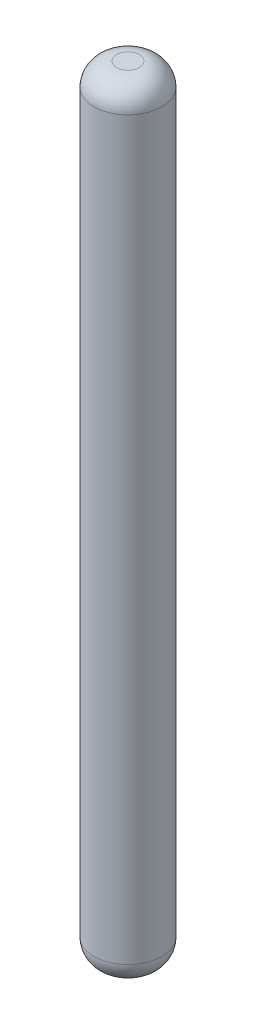
ISO-10303-21;
HEADER;
FILE_DESCRIPTION(('STEP AP214'),'2;1');
FILE_NAME('part.step','',(''),(''),'','','');
FILE_SCHEMA(('AUTOMOTIVE_DESIGN { 1 0 10303 214 1 1 1 1 }'));
ENDSEC;
DATA;
#1=APPLICATION_CONTEXT('core data for automotive mechanical design processes');
#2=APPLICATION_PROTOCOL_DEFINITION('international standard','automotive_design',2000,#1);
#3=PRODUCT_CONTEXT('',#1,'mechanical');
#4=PRODUCT('Part','Part','',(#3));
#5=PRODUCT_RELATED_PRODUCT_CATEGORY('part','',(#4));
#6=PRODUCT_DEFINITION_FORMATION('','',#4);
#7=PRODUCT_DEFINITION_CONTEXT('part definition',#1,'design');
#8=PRODUCT_DEFINITION('design','',#6,#7);
#9=PRODUCT_DEFINITION_SHAPE('','',#8);
#10=(LENGTH_UNIT() NAMED_UNIT(*) SI_UNIT(.MILLI.,.METRE.));
#11=(NAMED_UNIT(*) PLANE_ANGLE_UNIT() SI_UNIT($,.RADIAN.));
#12=(NAMED_UNIT(*) SI_UNIT($,.STERADIAN.) SOLID_ANGLE_UNIT());
#13=UNCERTAINTY_MEASURE_WITH_UNIT(LENGTH_MEASURE(1.E-05),#10,'distance_accuracy_value','');
#14=(GEOMETRIC_REPRESENTATION_CONTEXT(3) GLOBAL_UNCERTAINTY_ASSIGNED_CONTEXT((#13)) GLOBAL_UNIT_ASSIGNED_CONTEXT((#10,
#11,#12)) REPRESENTATION_CONTEXT('',''));
#15=CARTESIAN_POINT('',(0.,0.,0.));
#16=DIRECTION('',(0.,0.,1.));
#17=DIRECTION('',(1.,0.,0.));
#18=AXIS2_PLACEMENT_3D('',#15,#16,#17);
#19=CARTESIAN_POINT('',(0.,34.5,0.));
#20=DIRECTION('',(0.,-1.,0.));
#21=DIRECTION('',(0.,0.,-1.));
#22=AXIS2_PLACEMENT_3D('',#19,#20,#21);
#23=CYLINDRICAL_SURFACE('',#22,1.5);
#24=CARTESIAN_POINT('',(0.,33.5,0.));
#25=DIRECTION('',(0.,1.,0.));
#26=DIRECTION('',(0.,0.,1.));
#27=AXIS2_PLACEMENT_3D('',#24,#25,#26);
#28=CIRCLE('',#27,1.5);
#29=CARTESIAN_POINT('',(0.,33.5,1.5));
#30=VERTEX_POINT('',#29);
#31=EDGE_CURVE('E38',#30,#30,#28,.F.);
#32=ORIENTED_EDGE('',*,*,#31,.T.);
#33=EDGE_LOOP('',(#32));
#34=FACE_BOUND('',#33,.T.);
#35=CARTESIAN_POINT('',(0.,1.,0.));
#36=DIRECTION('',(0.,1.,0.));
#37=DIRECTION('',(0.,0.,1.));
#38=AXIS2_PLACEMENT_3D('',#35,#36,#37);
#39=CIRCLE('',#38,1.5);
#40=CARTESIAN_POINT('',(0.,1.,1.5));
#41=VERTEX_POINT('',#40);
#42=EDGE_CURVE('E42',#41,#41,#39,.T.);
#43=ORIENTED_EDGE('',*,*,#42,.T.);
#44=EDGE_LOOP('',(#43));
#45=FACE_BOUND('',#44,.T.);
#46=ADVANCED_FACE('F31',(#34,#45),#23,.T.);
#47=CARTESIAN_POINT('',(0.,34.5,0.));
#48=DIRECTION('',(0.,1.,0.));
#49=DIRECTION('',(0.,0.,1.));
#50=AXIS2_PLACEMENT_3D('',#47,#48,#49);
#51=PLANE('',#50);
#52=CARTESIAN_POINT('',(0.,34.5,0.));
#53=DIRECTION('',(0.,1.,0.));
#54=DIRECTION('',(0.,0.,1.));
#55=AXIS2_PLACEMENT_3D('',#52,#53,#54);
#56=CIRCLE('',#55,0.5);
#57=CARTESIAN_POINT('',(0.,34.5,0.5));
#58=VERTEX_POINT('',#57);
#59=EDGE_CURVE('E46',#58,#58,#56,.T.);
#60=ORIENTED_EDGE('',*,*,#59,.T.);
#61=EDGE_LOOP('',(#60));
#62=FACE_BOUND('',#61,.T.);
#63=ADVANCED_FACE('F52',(#62),#51,.T.);
#64=CARTESIAN_POINT('',(0.,0.,0.));
#65=DIRECTION('',(0.,1.,0.));
#66=DIRECTION('',(0.,0.,1.));
#67=AXIS2_PLACEMENT_3D('',#64,#65,#66);
#68=PLANE('',#67);
#69=CARTESIAN_POINT('',(0.,0.,0.));
#70=DIRECTION('',(0.,1.,0.));
#71=DIRECTION('',(0.,0.,1.));
#72=AXIS2_PLACEMENT_3D('',#69,#70,#71);
#73=CIRCLE('',#72,0.5);
#74=CARTESIAN_POINT('',(0.,0.,0.5));
#75=VERTEX_POINT('',#74);
#76=EDGE_CURVE('E10',#75,#75,#73,.F.);
#77=ORIENTED_EDGE('',*,*,#76,.T.);
#78=EDGE_LOOP('',(#77));
#79=FACE_BOUND('',#78,.T.);
#80=ADVANCED_FACE('F56',(#79),#68,.F.);
#81=CARTESIAN_POINT('',(0.,33.5,0.));
#82=DIRECTION('',(0.,1.,0.));
#83=DIRECTION('',(0.,0.,1.));
#84=AXIS2_PLACEMENT_3D('',#81,#82,#83);
#85=DEGENERATE_TOROIDAL_SURFACE('',#84,0.5,1.,.T.);
#86=ORIENTED_EDGE('',*,*,#31,.F.);
#87=EDGE_LOOP('',(#86));
#88=FACE_BOUND('',#87,.T.);
#89=ORIENTED_EDGE('',*,*,#59,.F.);
#90=EDGE_LOOP('',(#89));
#91=FACE_BOUND('',#90,.T.);
#92=ADVANCED_FACE('F54',(#88,#91),#85,.T.);
#93=CARTESIAN_POINT('',(0.,1.,0.));
#94=DIRECTION('',(0.,1.,0.));
#95=DIRECTION('',(0.,0.,1.));
#96=AXIS2_PLACEMENT_3D('',#93,#94,#95);
#97=DEGENERATE_TOROIDAL_SURFACE('',#96,0.5,1.,.T.);
#98=ORIENTED_EDGE('',*,*,#76,.F.);
#99=EDGE_LOOP('',(#98));
#100=FACE_BOUND('',#99,.T.);
#101=ORIENTED_EDGE('',*,*,#42,.F.);
#102=EDGE_LOOP('',(#101));
#103=FACE_BOUND('',#102,.T.);
#104=ADVANCED_FACE('F33',(#100,#103),#97,.T.);
#105=CLOSED_SHELL('',(#46,#63,#80,#92,#104));
#106=MANIFOLD_SOLID_BREP('B2',#105);
#107=ADVANCED_BREP_SHAPE_REPRESENTATION('',(#18,#106),#14);
#108=SHAPE_DEFINITION_REPRESENTATION(#9,#107);
ENDSEC;
END-ISO-10303-21;
